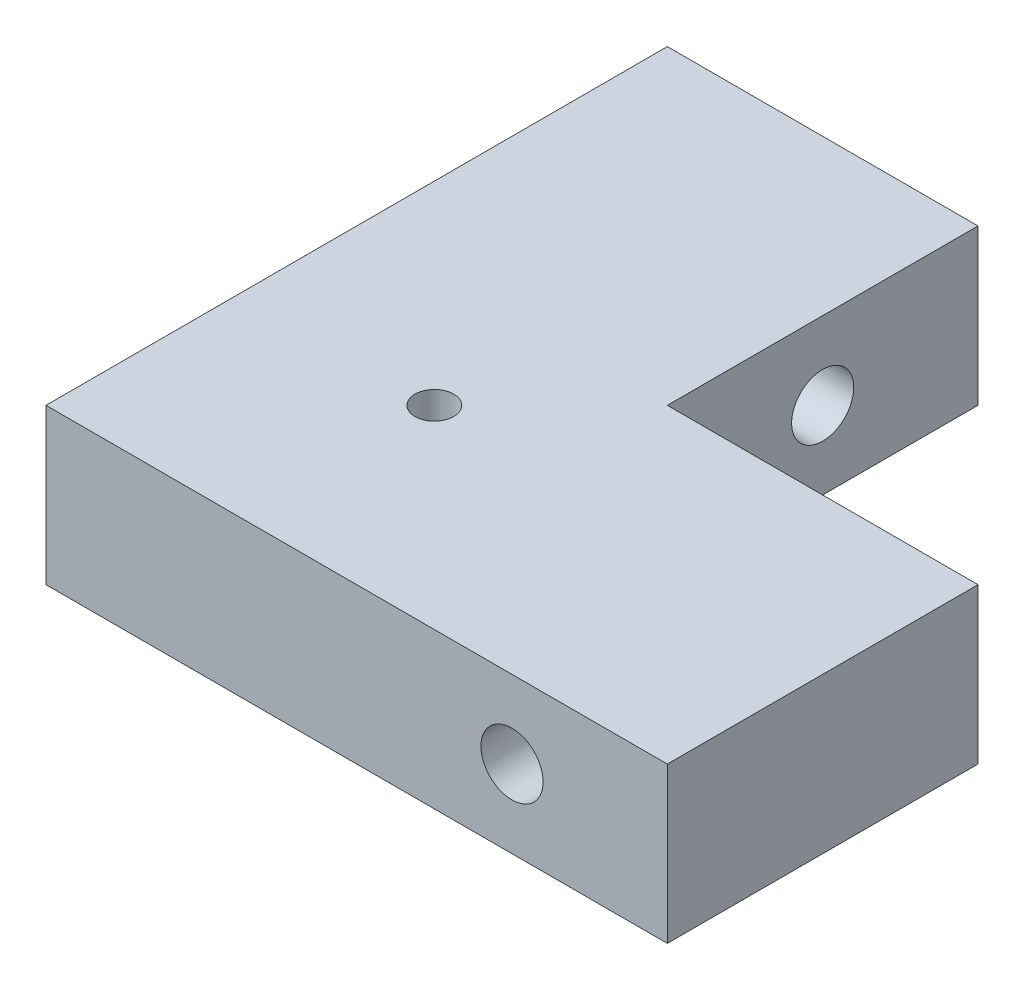
ISO-10303-21;
HEADER;
FILE_DESCRIPTION(('STEP AP214'),'2;1');
FILE_NAME('part.step','',(''),(''),'','','');
FILE_SCHEMA(('AUTOMOTIVE_DESIGN { 1 0 10303 214 1 1 1 1 }'));
ENDSEC;
DATA;
#1=APPLICATION_CONTEXT('core data for automotive mechanical design processes');
#2=APPLICATION_PROTOCOL_DEFINITION('international standard','automotive_design',2000,#1);
#3=PRODUCT_CONTEXT('',#1,'mechanical');
#4=PRODUCT('Part','Part','',(#3));
#5=PRODUCT_RELATED_PRODUCT_CATEGORY('part','',(#4));
#6=PRODUCT_DEFINITION_FORMATION('','',#4);
#7=PRODUCT_DEFINITION_CONTEXT('part definition',#1,'design');
#8=PRODUCT_DEFINITION('design','',#6,#7);
#9=PRODUCT_DEFINITION_SHAPE('','',#8);
#10=(LENGTH_UNIT() NAMED_UNIT(*) SI_UNIT(.MILLI.,.METRE.));
#11=(NAMED_UNIT(*) PLANE_ANGLE_UNIT() SI_UNIT($,.RADIAN.));
#12=(NAMED_UNIT(*) SI_UNIT($,.STERADIAN.) SOLID_ANGLE_UNIT());
#13=UNCERTAINTY_MEASURE_WITH_UNIT(LENGTH_MEASURE(1.E-05),#10,'distance_accuracy_value','');
#14=(GEOMETRIC_REPRESENTATION_CONTEXT(3) GLOBAL_UNCERTAINTY_ASSIGNED_CONTEXT((#13)) GLOBAL_UNIT_ASSIGNED_CONTEXT((#10,
#11,#12)) REPRESENTATION_CONTEXT('',''));
#15=CARTESIAN_POINT('',(0.,0.,0.));
#16=DIRECTION('',(0.,0.,1.));
#17=DIRECTION('',(1.,0.,0.));
#18=AXIS2_PLACEMENT_3D('',#15,#16,#17);
#19=CARTESIAN_POINT('',(-30.,20.,-36.304347826087));
#20=DIRECTION('',(0.,0.,1.));
#21=DIRECTION('',(1.,0.,0.));
#22=AXIS2_PLACEMENT_3D('',#19,#20,#21);
#23=PLANE('',#22);
#24=DIRECTION('',(-1.,0.,0.));
#25=VECTOR('',#24,1.);
#26=CARTESIAN_POINT('',(-30.,0.,-36.304347826087));
#27=LINE('',#26,#25);
#28=CARTESIAN_POINT('',(-30.,0.,-36.304347826087));
#29=VERTEX_POINT('',#28);
#30=CARTESIAN_POINT('',(-70.,0.,-36.3043478260869));
#31=VERTEX_POINT('',#30);
#32=EDGE_CURVE('E128',#29,#31,#27,.T.);
#33=ORIENTED_EDGE('',*,*,#32,.T.);
#34=DIRECTION('',(0.,-1.,0.));
#35=VECTOR('',#34,1.);
#36=CARTESIAN_POINT('',(-70.,20.,-36.3043478260869));
#37=LINE('',#36,#35);
#38=CARTESIAN_POINT('',(-70.,20.,-36.3043478260869));
#39=VERTEX_POINT('',#38);
#40=EDGE_CURVE('E11',#39,#31,#37,.T.);
#41=ORIENTED_EDGE('',*,*,#40,.F.);
#42=DIRECTION('',(-1.,0.,0.));
#43=VECTOR('',#42,1.);
#44=CARTESIAN_POINT('',(-30.,20.,-36.304347826087));
#45=LINE('',#44,#43);
#46=CARTESIAN_POINT('',(-30.,20.,-36.304347826087));
#47=VERTEX_POINT('',#46);
#48=EDGE_CURVE('E145',#47,#39,#45,.T.);
#49=ORIENTED_EDGE('',*,*,#48,.F.);
#50=DIRECTION('',(0.,-1.,0.));
#51=VECTOR('',#50,1.);
#52=CARTESIAN_POINT('',(-30.,20.,-36.304347826087));
#53=LINE('',#52,#51);
#54=EDGE_CURVE('E124',#47,#29,#53,.T.);
#55=ORIENTED_EDGE('',*,*,#54,.T.);
#56=EDGE_LOOP('',(#33,#41,#49,#55));
#57=FACE_BOUND('',#56,.T.);
#58=ADVANCED_FACE('F39',(#57),#23,.F.);
#59=CARTESIAN_POINT('',(-70.,20.,-36.3043478260869));
#60=DIRECTION('',(1.,0.,0.));
#61=DIRECTION('',(0.,0.,-1.));
#62=AXIS2_PLACEMENT_3D('',#59,#60,#61);
#63=PLANE('',#62);
#64=CARTESIAN_POINT('',(-70.,10.,-16.304347826087));
#65=DIRECTION('',(1.,0.,0.));
#66=DIRECTION('',(0.,0.,-1.));
#67=AXIS2_PLACEMENT_3D('',#64,#65,#66);
#68=CIRCLE('',#67,4.);
#69=CARTESIAN_POINT('',(-70.,10.,-20.304347826087));
#70=VERTEX_POINT('',#69);
#71=EDGE_CURVE('E133',#70,#70,#68,.T.);
#72=ORIENTED_EDGE('',*,*,#71,.T.);
#73=EDGE_LOOP('',(#72));
#74=FACE_BOUND('',#73,.T.);
#75=DIRECTION('',(0.,0.,1.));
#76=VECTOR('',#75,1.);
#77=CARTESIAN_POINT('',(-70.,0.,-36.3043478260869));
#78=LINE('',#77,#76);
#79=CARTESIAN_POINT('',(-70.,0.,43.695652173913));
#80=VERTEX_POINT('',#79);
#81=EDGE_CURVE('E132',#31,#80,#78,.T.);
#82=ORIENTED_EDGE('',*,*,#81,.T.);
#83=DIRECTION('',(0.,-1.,0.));
#84=VECTOR('',#83,1.);
#85=CARTESIAN_POINT('',(-70.,20.,43.695652173913));
#86=LINE('',#85,#84);
#87=CARTESIAN_POINT('',(-70.,20.,43.695652173913));
#88=VERTEX_POINT('',#87);
#89=EDGE_CURVE('E48',#88,#80,#86,.T.);
#90=ORIENTED_EDGE('',*,*,#89,.F.);
#91=DIRECTION('',(0.,0.,1.));
#92=VECTOR('',#91,1.);
#93=CARTESIAN_POINT('',(-70.,20.,-36.3043478260869));
#94=LINE('',#93,#92);
#95=EDGE_CURVE('E93',#39,#88,#94,.T.);
#96=ORIENTED_EDGE('',*,*,#95,.F.);
#97=ORIENTED_EDGE('',*,*,#40,.T.);
#98=EDGE_LOOP('',(#82,#90,#96,#97));
#99=FACE_BOUND('',#98,.T.);
#100=ADVANCED_FACE('F178',(#74,#99),#63,.F.);
#101=CARTESIAN_POINT('',(-70.,20.,43.695652173913));
#102=DIRECTION('',(0.,0.,-1.));
#103=DIRECTION('',(-1.,0.,0.));
#104=AXIS2_PLACEMENT_3D('',#101,#102,#103);
#105=PLANE('',#104);
#106=CARTESIAN_POINT('',(-10.,10.,43.695652173913));
#107=DIRECTION('',(0.,0.,-1.));
#108=DIRECTION('',(-1.,0.,0.));
#109=AXIS2_PLACEMENT_3D('',#106,#107,#108);
#110=CIRCLE('',#109,4.);
#111=CARTESIAN_POINT('',(-14.,10.,43.695652173913));
#112=VERTEX_POINT('',#111);
#113=EDGE_CURVE('E249',#112,#112,#110,.T.);
#114=ORIENTED_EDGE('',*,*,#113,.T.);
#115=EDGE_LOOP('',(#114));
#116=FACE_BOUND('',#115,.T.);
#117=DIRECTION('',(1.,0.,0.));
#118=VECTOR('',#117,1.);
#119=CARTESIAN_POINT('',(-70.,0.,43.695652173913));
#120=LINE('',#119,#118);
#121=CARTESIAN_POINT('',(10.,0.,43.695652173913));
#122=VERTEX_POINT('',#121);
#123=EDGE_CURVE('E136',#80,#122,#120,.T.);
#124=ORIENTED_EDGE('',*,*,#123,.T.);
#125=DIRECTION('',(0.,-1.,0.));
#126=VECTOR('',#125,1.);
#127=CARTESIAN_POINT('',(10.,20.,43.695652173913));
#128=LINE('',#127,#126);
#129=CARTESIAN_POINT('',(10.,20.,43.695652173913));
#130=VERTEX_POINT('',#129);
#131=EDGE_CURVE('E117',#130,#122,#128,.T.);
#132=ORIENTED_EDGE('',*,*,#131,.F.);
#133=DIRECTION('',(1.,0.,0.));
#134=VECTOR('',#133,1.);
#135=CARTESIAN_POINT('',(-70.,20.,43.695652173913));
#136=LINE('',#135,#134);
#137=EDGE_CURVE('E106',#88,#130,#136,.T.);
#138=ORIENTED_EDGE('',*,*,#137,.F.);
#139=ORIENTED_EDGE('',*,*,#89,.T.);
#140=EDGE_LOOP('',(#124,#132,#138,#139));
#141=FACE_BOUND('',#140,.T.);
#142=ADVANCED_FACE('F155',(#116,#141),#105,.F.);
#143=CARTESIAN_POINT('',(10.,20.,43.695652173913));
#144=DIRECTION('',(-1.,0.,0.));
#145=DIRECTION('',(0.,0.,1.));
#146=AXIS2_PLACEMENT_3D('',#143,#144,#145);
#147=PLANE('',#146);
#148=DIRECTION('',(0.,0.,-1.));
#149=VECTOR('',#148,1.);
#150=CARTESIAN_POINT('',(10.,0.,43.695652173913));
#151=LINE('',#150,#149);
#152=CARTESIAN_POINT('',(10.,0.,3.69565217391304));
#153=VERTEX_POINT('',#152);
#154=EDGE_CURVE('E115',#122,#153,#151,.T.);
#155=ORIENTED_EDGE('',*,*,#154,.T.);
#156=DIRECTION('',(0.,-1.,0.));
#157=VECTOR('',#156,1.);
#158=CARTESIAN_POINT('',(10.,20.,3.69565217391304));
#159=LINE('',#158,#157);
#160=CARTESIAN_POINT('',(10.,20.,3.69565217391304));
#161=VERTEX_POINT('',#160);
#162=EDGE_CURVE('E112',#161,#153,#159,.T.);
#163=ORIENTED_EDGE('',*,*,#162,.F.);
#164=DIRECTION('',(0.,0.,-1.));
#165=VECTOR('',#164,1.);
#166=CARTESIAN_POINT('',(10.,20.,43.695652173913));
#167=LINE('',#166,#165);
#168=EDGE_CURVE('E100',#130,#161,#167,.T.);
#169=ORIENTED_EDGE('',*,*,#168,.F.);
#170=ORIENTED_EDGE('',*,*,#131,.T.);
#171=EDGE_LOOP('',(#155,#163,#169,#170));
#172=FACE_BOUND('',#171,.T.);
#173=ADVANCED_FACE('F113',(#172),#147,.F.);
#174=CARTESIAN_POINT('',(10.,20.,3.69565217391304));
#175=DIRECTION('',(0.,0.,1.));
#176=DIRECTION('',(1.,0.,0.));
#177=AXIS2_PLACEMENT_3D('',#174,#175,#176);
#178=PLANE('',#177);
#179=CARTESIAN_POINT('',(-10.,10.,3.69565217391304));
#180=DIRECTION('',(0.,0.,-1.));
#181=DIRECTION('',(-1.,0.,0.));
#182=AXIS2_PLACEMENT_3D('',#179,#180,#181);
#183=CIRCLE('',#182,4.);
#184=CARTESIAN_POINT('',(-14.,10.,3.69565217391304));
#185=VERTEX_POINT('',#184);
#186=EDGE_CURVE('E255',#185,#185,#183,.T.);
#187=ORIENTED_EDGE('',*,*,#186,.F.);
#188=EDGE_LOOP('',(#187));
#189=FACE_BOUND('',#188,.T.);
#190=DIRECTION('',(-1.,0.,0.));
#191=VECTOR('',#190,1.);
#192=CARTESIAN_POINT('',(10.,0.,3.69565217391304));
#193=LINE('',#192,#191);
#194=CARTESIAN_POINT('',(-30.,0.,3.69565217391305));
#195=VERTEX_POINT('',#194);
#196=EDGE_CURVE('E79',#153,#195,#193,.T.);
#197=ORIENTED_EDGE('',*,*,#196,.T.);
#198=DIRECTION('',(0.,-1.,0.));
#199=VECTOR('',#198,1.);
#200=CARTESIAN_POINT('',(-30.,20.,3.69565217391305));
#201=LINE('',#200,#199);
#202=CARTESIAN_POINT('',(-30.,20.,3.69565217391305));
#203=VERTEX_POINT('',#202);
#204=EDGE_CURVE('E118',#203,#195,#201,.T.);
#205=ORIENTED_EDGE('',*,*,#204,.F.);
#206=DIRECTION('',(-1.,0.,0.));
#207=VECTOR('',#206,1.);
#208=CARTESIAN_POINT('',(10.,20.,3.69565217391304));
#209=LINE('',#208,#207);
#210=EDGE_CURVE('E104',#161,#203,#209,.T.);
#211=ORIENTED_EDGE('',*,*,#210,.F.);
#212=ORIENTED_EDGE('',*,*,#162,.T.);
#213=EDGE_LOOP('',(#197,#205,#211,#212));
#214=FACE_BOUND('',#213,.T.);
#215=ADVANCED_FACE('F120',(#189,#214),#178,.F.);
#216=CARTESIAN_POINT('',(-30.,20.,3.69565217391305));
#217=DIRECTION('',(-1.,0.,0.));
#218=DIRECTION('',(0.,0.,1.));
#219=AXIS2_PLACEMENT_3D('',#216,#217,#218);
#220=PLANE('',#219);
#221=CARTESIAN_POINT('',(-30.,10.,-16.304347826087));
#222=DIRECTION('',(1.,0.,0.));
#223=DIRECTION('',(0.,0.,-1.));
#224=AXIS2_PLACEMENT_3D('',#221,#222,#223);
#225=CIRCLE('',#224,4.);
#226=CARTESIAN_POINT('',(-30.,10.,-20.304347826087));
#227=VERTEX_POINT('',#226);
#228=EDGE_CURVE('E247',#227,#227,#225,.T.);
#229=ORIENTED_EDGE('',*,*,#228,.F.);
#230=EDGE_LOOP('',(#229));
#231=FACE_BOUND('',#230,.T.);
#232=DIRECTION('',(0.,0.,-1.));
#233=VECTOR('',#232,1.);
#234=CARTESIAN_POINT('',(-30.,0.,3.69565217391305));
#235=LINE('',#234,#233);
#236=EDGE_CURVE('E85',#195,#29,#235,.T.);
#237=ORIENTED_EDGE('',*,*,#236,.T.);
#238=ORIENTED_EDGE('',*,*,#54,.F.);
#239=DIRECTION('',(0.,0.,-1.));
#240=VECTOR('',#239,1.);
#241=CARTESIAN_POINT('',(-30.,20.,3.69565217391305));
#242=LINE('',#241,#240);
#243=EDGE_CURVE('E56',#203,#47,#242,.T.);
#244=ORIENTED_EDGE('',*,*,#243,.F.);
#245=ORIENTED_EDGE('',*,*,#204,.T.);
#246=EDGE_LOOP('',(#237,#238,#244,#245));
#247=FACE_BOUND('',#246,.T.);
#248=ADVANCED_FACE('F162',(#231,#247),#220,.F.);
#249=CARTESIAN_POINT('',(0.,20.,0.));
#250=DIRECTION('',(0.,1.,0.));
#251=DIRECTION('',(0.,0.,1.));
#252=AXIS2_PLACEMENT_3D('',#249,#250,#251);
#253=PLANE('',#252);
#254=CARTESIAN_POINT('',(-45.,20.,18.695652173913));
#255=DIRECTION('',(0.,-1.,0.));
#256=DIRECTION('',(0.,0.,-1.));
#257=AXIS2_PLACEMENT_3D('',#254,#255,#256);
#258=CIRCLE('',#257,2.5);
#259=CARTESIAN_POINT('',(-45.,20.,16.195652173913));
#260=VERTEX_POINT('',#259);
#261=EDGE_CURVE('E265',#260,#260,#258,.T.);
#262=ORIENTED_EDGE('',*,*,#261,.T.);
#263=EDGE_LOOP('',(#262));
#264=FACE_BOUND('',#263,.T.);
#265=ORIENTED_EDGE('',*,*,#48,.T.);
#266=ORIENTED_EDGE('',*,*,#95,.T.);
#267=ORIENTED_EDGE('',*,*,#137,.T.);
#268=ORIENTED_EDGE('',*,*,#168,.T.);
#269=ORIENTED_EDGE('',*,*,#210,.T.);
#270=ORIENTED_EDGE('',*,*,#243,.T.);
#271=EDGE_LOOP('',(#265,#266,#267,#268,#269,#270));
#272=FACE_BOUND('',#271,.T.);
#273=ADVANCED_FACE('F102',(#264,#272),#253,.T.);
#274=CARTESIAN_POINT('',(0.,0.,0.));
#275=DIRECTION('',(0.,1.,0.));
#276=DIRECTION('',(0.,0.,1.));
#277=AXIS2_PLACEMENT_3D('',#274,#275,#276);
#278=PLANE('',#277);
#279=CARTESIAN_POINT('',(-45.,0.,18.695652173913));
#280=DIRECTION('',(0.,-1.,0.));
#281=DIRECTION('',(0.,0.,-1.));
#282=AXIS2_PLACEMENT_3D('',#279,#280,#281);
#283=CIRCLE('',#282,2.5);
#284=CARTESIAN_POINT('',(-45.,0.,16.195652173913));
#285=VERTEX_POINT('',#284);
#286=EDGE_CURVE('E267',#285,#285,#283,.T.);
#287=ORIENTED_EDGE('',*,*,#286,.F.);
#288=EDGE_LOOP('',(#287));
#289=FACE_BOUND('',#288,.T.);
#290=ORIENTED_EDGE('',*,*,#32,.F.);
#291=ORIENTED_EDGE('',*,*,#236,.F.);
#292=ORIENTED_EDGE('',*,*,#196,.F.);
#293=ORIENTED_EDGE('',*,*,#154,.F.);
#294=ORIENTED_EDGE('',*,*,#123,.F.);
#295=ORIENTED_EDGE('',*,*,#81,.F.);
#296=EDGE_LOOP('',(#290,#291,#292,#293,#294,#295));
#297=FACE_BOUND('',#296,.T.);
#298=ADVANCED_FACE('F158',(#289,#297),#278,.F.);
#299=CARTESIAN_POINT('',(-70.,10.,-16.304347826087));
#300=DIRECTION('',(1.,0.,0.));
#301=DIRECTION('',(0.,0.,-1.));
#302=AXIS2_PLACEMENT_3D('',#299,#300,#301);
#303=CYLINDRICAL_SURFACE('',#302,4.);
#304=ORIENTED_EDGE('',*,*,#71,.F.);
#305=EDGE_LOOP('',(#304));
#306=FACE_BOUND('',#305,.T.);
#307=ORIENTED_EDGE('',*,*,#228,.T.);
#308=EDGE_LOOP('',(#307));
#309=FACE_BOUND('',#308,.T.);
#310=ADVANCED_FACE('F213',(#306,#309),#303,.F.);
#311=CARTESIAN_POINT('',(-10.,10.,43.695652173913));
#312=DIRECTION('',(0.,0.,-1.));
#313=DIRECTION('',(-1.,0.,0.));
#314=AXIS2_PLACEMENT_3D('',#311,#312,#313);
#315=CYLINDRICAL_SURFACE('',#314,4.);
#316=ORIENTED_EDGE('',*,*,#113,.F.);
#317=EDGE_LOOP('',(#316));
#318=FACE_BOUND('',#317,.T.);
#319=ORIENTED_EDGE('',*,*,#186,.T.);
#320=EDGE_LOOP('',(#319));
#321=FACE_BOUND('',#320,.T.);
#322=ADVANCED_FACE('F208',(#318,#321),#315,.F.);
#323=CARTESIAN_POINT('',(-45.,20.,18.695652173913));
#324=DIRECTION('',(0.,-1.,0.));
#325=DIRECTION('',(0.,0.,-1.));
#326=AXIS2_PLACEMENT_3D('',#323,#324,#325);
#327=CYLINDRICAL_SURFACE('',#326,2.5);
#328=ORIENTED_EDGE('',*,*,#261,.F.);
#329=EDGE_LOOP('',(#328));
#330=FACE_BOUND('',#329,.T.);
#331=ORIENTED_EDGE('',*,*,#286,.T.);
#332=EDGE_LOOP('',(#331));
#333=FACE_BOUND('',#332,.T.);
#334=ADVANCED_FACE('F212',(#330,#333),#327,.F.);
#335=CLOSED_SHELL('',(#58,#100,#142,#173,#215,#248,#273,#298,#310,#322,#334));
#336=MANIFOLD_SOLID_BREP('B2',#335);
#337=ADVANCED_BREP_SHAPE_REPRESENTATION('',(#18,#336),#14);
#338=SHAPE_DEFINITION_REPRESENTATION(#9,#337);
ENDSEC;
END-ISO-10303-21;
